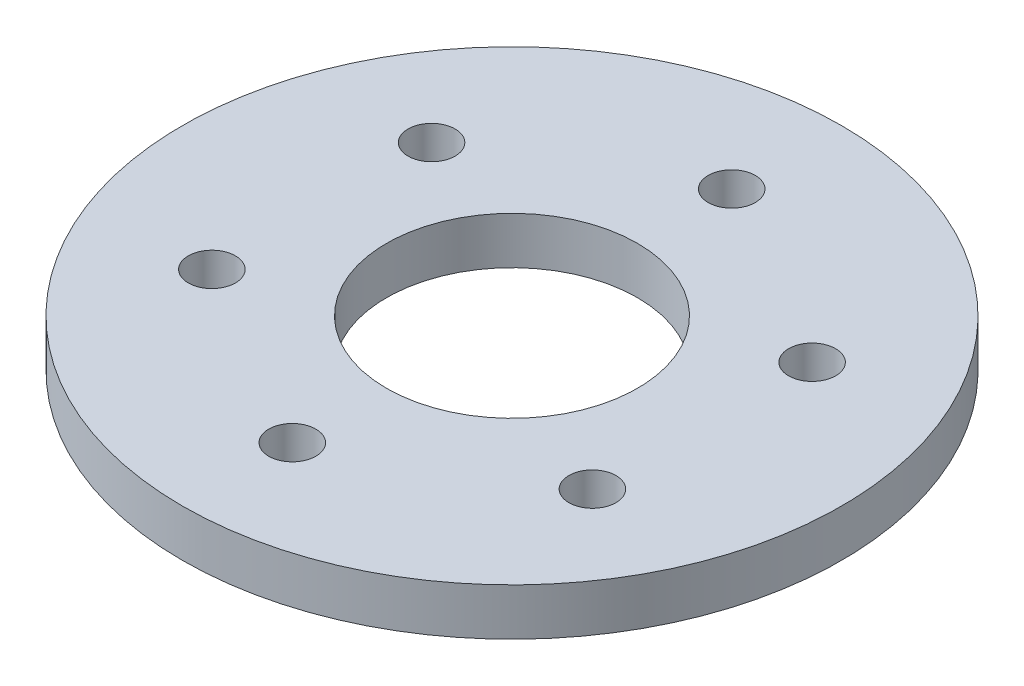
ISO-10303-21;
HEADER;
FILE_DESCRIPTION(('STEP AP214'),'2;1');
FILE_NAME('part.step','',(''),(''),'','','');
FILE_SCHEMA(('AUTOMOTIVE_DESIGN { 1 0 10303 214 1 1 1 1 }'));
ENDSEC;
DATA;
#1=APPLICATION_CONTEXT('core data for automotive mechanical design processes');
#2=APPLICATION_PROTOCOL_DEFINITION('international standard','automotive_design',2000,#1);
#3=PRODUCT_CONTEXT('',#1,'mechanical');
#4=PRODUCT('Part','Part','',(#3));
#5=PRODUCT_RELATED_PRODUCT_CATEGORY('part','',(#4));
#6=PRODUCT_DEFINITION_FORMATION('','',#4);
#7=PRODUCT_DEFINITION_CONTEXT('part definition',#1,'design');
#8=PRODUCT_DEFINITION('design','',#6,#7);
#9=PRODUCT_DEFINITION_SHAPE('','',#8);
#10=(LENGTH_UNIT() NAMED_UNIT(*) SI_UNIT(.MILLI.,.METRE.));
#11=(NAMED_UNIT(*) PLANE_ANGLE_UNIT() SI_UNIT($,.RADIAN.));
#12=(NAMED_UNIT(*) SI_UNIT($,.STERADIAN.) SOLID_ANGLE_UNIT());
#13=UNCERTAINTY_MEASURE_WITH_UNIT(LENGTH_MEASURE(1.E-05),#10,'distance_accuracy_value','');
#14=(GEOMETRIC_REPRESENTATION_CONTEXT(3) GLOBAL_UNCERTAINTY_ASSIGNED_CONTEXT((#13)) GLOBAL_UNIT_ASSIGNED_CONTEXT((#10,
#11,#12)) REPRESENTATION_CONTEXT('',''));
#15=CARTESIAN_POINT('',(0.,0.,0.));
#16=DIRECTION('',(0.,0.,1.));
#17=DIRECTION('',(1.,0.,0.));
#18=AXIS2_PLACEMENT_3D('',#15,#16,#17);
#19=CARTESIAN_POINT('',(0.,3.,0.));
#20=DIRECTION('',(0.,1.,0.));
#21=DIRECTION('',(0.,0.,1.));
#22=AXIS2_PLACEMENT_3D('',#19,#20,#21);
#23=PLANE('',#22);
#24=CARTESIAN_POINT('',(-12.1243556529812,3.,7.00000000000052));
#25=DIRECTION('',(0.,1.,0.));
#26=DIRECTION('',(0.,0.,1.));
#27=AXIS2_PLACEMENT_3D('',#24,#25,#26);
#28=CIRCLE('',#27,1.50000000000113);
#29=CARTESIAN_POINT('',(-12.1243556529812,3.,8.50000000000166));
#30=VERTEX_POINT('',#29);
#31=EDGE_CURVE('E74',#30,#30,#28,.T.);
#32=ORIENTED_EDGE('',*,*,#31,.F.);
#33=EDGE_LOOP('',(#32));
#34=FACE_BOUND('',#33,.T.);
#35=CARTESIAN_POINT('',(12.124355652983,3.,6.99999999999948));
#36=DIRECTION('',(0.,1.,0.));
#37=DIRECTION('',(0.,0.,1.));
#38=AXIS2_PLACEMENT_3D('',#35,#36,#37);
#39=CIRCLE('',#38,1.50000000000077);
#40=CARTESIAN_POINT('',(12.124355652983,3.,8.50000000000025));
#41=VERTEX_POINT('',#40);
#42=EDGE_CURVE('E62',#41,#41,#39,.T.);
#43=ORIENTED_EDGE('',*,*,#42,.F.);
#44=EDGE_LOOP('',(#43));
#45=FACE_BOUND('',#44,.T.);
#46=CARTESIAN_POINT('',(0.,3.,0.));
#47=DIRECTION('',(0.,1.,0.));
#48=DIRECTION('',(0.,0.,1.));
#49=AXIS2_PLACEMENT_3D('',#46,#47,#48);
#50=CIRCLE('',#49,8.);
#51=CARTESIAN_POINT('',(0.,3.,8.));
#52=VERTEX_POINT('',#51);
#53=EDGE_CURVE('E50',#52,#52,#50,.T.);
#54=ORIENTED_EDGE('',*,*,#53,.F.);
#55=EDGE_LOOP('',(#54));
#56=FACE_BOUND('',#55,.T.);
#57=CARTESIAN_POINT('',(0.,3.,0.));
#58=DIRECTION('',(0.,1.,0.));
#59=DIRECTION('',(0.,0.,1.));
#60=AXIS2_PLACEMENT_3D('',#57,#58,#59);
#61=CIRCLE('',#60,21.);
#62=CARTESIAN_POINT('',(0.,3.,21.));
#63=VERTEX_POINT('',#62);
#64=EDGE_CURVE('E10',#63,#63,#61,.T.);
#65=ORIENTED_EDGE('',*,*,#64,.T.);
#66=EDGE_LOOP('',(#65));
#67=FACE_BOUND('',#66,.T.);
#68=CARTESIAN_POINT('',(0.,3.,-14.));
#69=DIRECTION('',(0.,1.,0.));
#70=DIRECTION('',(0.,0.,1.));
#71=AXIS2_PLACEMENT_3D('',#68,#69,#70);
#72=CIRCLE('',#71,1.5);
#73=CARTESIAN_POINT('',(0.,3.,-12.5));
#74=VERTEX_POINT('',#73);
#75=EDGE_CURVE('E45',#74,#74,#72,.T.);
#76=ORIENTED_EDGE('',*,*,#75,.F.);
#77=EDGE_LOOP('',(#76));
#78=FACE_BOUND('',#77,.T.);
#79=CARTESIAN_POINT('',(12.1243556529824,3.,-7.00000000000052));
#80=DIRECTION('',(0.,1.,0.));
#81=DIRECTION('',(0.,0.,1.));
#82=AXIS2_PLACEMENT_3D('',#79,#80,#81);
#83=CIRCLE('',#82,1.50000000000017);
#84=CARTESIAN_POINT('',(12.1243556529824,3.,-5.50000000000035));
#85=VERTEX_POINT('',#84);
#86=EDGE_CURVE('E56',#85,#85,#83,.T.);
#87=ORIENTED_EDGE('',*,*,#86,.F.);
#88=EDGE_LOOP('',(#87));
#89=FACE_BOUND('',#88,.T.);
#90=CARTESIAN_POINT('',(1.18856827952055E-12,3.,14.));
#91=DIRECTION('',(0.,1.,0.));
#92=DIRECTION('',(0.,0.,1.));
#93=AXIS2_PLACEMENT_3D('',#90,#91,#92);
#94=CIRCLE('',#93,1.50000000000123);
#95=CARTESIAN_POINT('',(1.18856827952055E-12,3.,15.5000000000012));
#96=VERTEX_POINT('',#95);
#97=EDGE_CURVE('E68',#96,#96,#94,.T.);
#98=ORIENTED_EDGE('',*,*,#97,.F.);
#99=EDGE_LOOP('',(#98));
#100=FACE_BOUND('',#99,.T.);
#101=CARTESIAN_POINT('',(-12.1243556529819,3.,-6.99999999999948));
#102=DIRECTION('',(0.,1.,0.));
#103=DIRECTION('',(0.,0.,1.));
#104=AXIS2_PLACEMENT_3D('',#101,#102,#103);
#105=CIRCLE('',#104,1.5000000000006);
#106=CARTESIAN_POINT('',(-12.1243556529819,3.,-5.49999999999888));
#107=VERTEX_POINT('',#106);
#108=EDGE_CURVE('E80',#107,#107,#105,.T.);
#109=ORIENTED_EDGE('',*,*,#108,.F.);
#110=EDGE_LOOP('',(#109));
#111=FACE_BOUND('',#110,.T.);
#112=ADVANCED_FACE('F34',(#34,#45,#56,#67,#78,#89,#100,#111),#23,.T.);
#113=CARTESIAN_POINT('',(0.,0.,0.));
#114=DIRECTION('',(0.,1.,0.));
#115=DIRECTION('',(0.,0.,1.));
#116=AXIS2_PLACEMENT_3D('',#113,#114,#115);
#117=PLANE('',#116);
#118=CARTESIAN_POINT('',(0.,0.,0.));
#119=DIRECTION('',(0.,1.,0.));
#120=DIRECTION('',(0.,0.,1.));
#121=AXIS2_PLACEMENT_3D('',#118,#119,#120);
#122=CIRCLE('',#121,21.);
#123=CARTESIAN_POINT('',(0.,0.,21.));
#124=VERTEX_POINT('',#123);
#125=EDGE_CURVE('E38',#124,#124,#122,.T.);
#126=ORIENTED_EDGE('',*,*,#125,.F.);
#127=EDGE_LOOP('',(#126));
#128=FACE_BOUND('',#127,.T.);
#129=CARTESIAN_POINT('',(0.,0.,-14.));
#130=DIRECTION('',(0.,1.,0.));
#131=DIRECTION('',(0.,0.,1.));
#132=AXIS2_PLACEMENT_3D('',#129,#130,#131);
#133=CIRCLE('',#132,1.5);
#134=CARTESIAN_POINT('',(0.,0.,-12.5));
#135=VERTEX_POINT('',#134);
#136=EDGE_CURVE('E47',#135,#135,#133,.T.);
#137=ORIENTED_EDGE('',*,*,#136,.T.);
#138=EDGE_LOOP('',(#137));
#139=FACE_BOUND('',#138,.T.);
#140=CARTESIAN_POINT('',(0.,0.,0.));
#141=DIRECTION('',(0.,1.,0.));
#142=DIRECTION('',(0.,0.,1.));
#143=AXIS2_PLACEMENT_3D('',#140,#141,#142);
#144=CIRCLE('',#143,8.);
#145=CARTESIAN_POINT('',(0.,0.,8.));
#146=VERTEX_POINT('',#145);
#147=EDGE_CURVE('E53',#146,#146,#144,.T.);
#148=ORIENTED_EDGE('',*,*,#147,.T.);
#149=EDGE_LOOP('',(#148));
#150=FACE_BOUND('',#149,.T.);
#151=CARTESIAN_POINT('',(12.1243556529824,0.,-7.00000000000052));
#152=DIRECTION('',(0.,1.,0.));
#153=DIRECTION('',(0.,0.,1.));
#154=AXIS2_PLACEMENT_3D('',#151,#152,#153);
#155=CIRCLE('',#154,1.50000000000017);
#156=CARTESIAN_POINT('',(12.1243556529824,0.,-5.50000000000035));
#157=VERTEX_POINT('',#156);
#158=EDGE_CURVE('E59',#157,#157,#155,.T.);
#159=ORIENTED_EDGE('',*,*,#158,.T.);
#160=EDGE_LOOP('',(#159));
#161=FACE_BOUND('',#160,.T.);
#162=CARTESIAN_POINT('',(12.124355652983,0.,6.99999999999948));
#163=DIRECTION('',(0.,1.,0.));
#164=DIRECTION('',(0.,0.,1.));
#165=AXIS2_PLACEMENT_3D('',#162,#163,#164);
#166=CIRCLE('',#165,1.50000000000077);
#167=CARTESIAN_POINT('',(12.124355652983,0.,8.50000000000025));
#168=VERTEX_POINT('',#167);
#169=EDGE_CURVE('E65',#168,#168,#166,.T.);
#170=ORIENTED_EDGE('',*,*,#169,.T.);
#171=EDGE_LOOP('',(#170));
#172=FACE_BOUND('',#171,.T.);
#173=CARTESIAN_POINT('',(1.18856827952055E-12,0.,14.));
#174=DIRECTION('',(0.,1.,0.));
#175=DIRECTION('',(0.,0.,1.));
#176=AXIS2_PLACEMENT_3D('',#173,#174,#175);
#177=CIRCLE('',#176,1.50000000000123);
#178=CARTESIAN_POINT('',(1.18856827952055E-12,0.,15.5000000000012));
#179=VERTEX_POINT('',#178);
#180=EDGE_CURVE('E71',#179,#179,#177,.T.);
#181=ORIENTED_EDGE('',*,*,#180,.T.);
#182=EDGE_LOOP('',(#181));
#183=FACE_BOUND('',#182,.T.);
#184=CARTESIAN_POINT('',(-12.1243556529812,0.,7.00000000000052));
#185=DIRECTION('',(0.,1.,0.));
#186=DIRECTION('',(0.,0.,1.));
#187=AXIS2_PLACEMENT_3D('',#184,#185,#186);
#188=CIRCLE('',#187,1.50000000000113);
#189=CARTESIAN_POINT('',(-12.1243556529812,0.,8.50000000000166));
#190=VERTEX_POINT('',#189);
#191=EDGE_CURVE('E77',#190,#190,#188,.T.);
#192=ORIENTED_EDGE('',*,*,#191,.T.);
#193=EDGE_LOOP('',(#192));
#194=FACE_BOUND('',#193,.T.);
#195=CARTESIAN_POINT('',(-12.1243556529819,0.,-6.99999999999948));
#196=DIRECTION('',(0.,1.,0.));
#197=DIRECTION('',(0.,0.,1.));
#198=AXIS2_PLACEMENT_3D('',#195,#196,#197);
#199=CIRCLE('',#198,1.5000000000006);
#200=CARTESIAN_POINT('',(-12.1243556529819,0.,-5.49999999999888));
#201=VERTEX_POINT('',#200);
#202=EDGE_CURVE('E83',#201,#201,#199,.T.);
#203=ORIENTED_EDGE('',*,*,#202,.T.);
#204=EDGE_LOOP('',(#203));
#205=FACE_BOUND('',#204,.T.);
#206=ADVANCED_FACE('F93',(#128,#139,#150,#161,#172,#183,#194,#205),#117,.F.);
#207=CARTESIAN_POINT('',(0.,3.,0.));
#208=DIRECTION('',(0.,-1.,0.));
#209=DIRECTION('',(0.,0.,-1.));
#210=AXIS2_PLACEMENT_3D('',#207,#208,#209);
#211=CYLINDRICAL_SURFACE('',#210,21.);
#212=ORIENTED_EDGE('',*,*,#64,.F.);
#213=EDGE_LOOP('',(#212));
#214=FACE_BOUND('',#213,.T.);
#215=ORIENTED_EDGE('',*,*,#125,.T.);
#216=EDGE_LOOP('',(#215));
#217=FACE_BOUND('',#216,.T.);
#218=ADVANCED_FACE('F36',(#214,#217),#211,.T.);
#219=CARTESIAN_POINT('',(0.,3.,-14.));
#220=DIRECTION('',(0.,-1.,0.));
#221=DIRECTION('',(0.,0.,-1.));
#222=AXIS2_PLACEMENT_3D('',#219,#220,#221);
#223=CYLINDRICAL_SURFACE('',#222,1.5);
#224=ORIENTED_EDGE('',*,*,#75,.T.);
#225=EDGE_LOOP('',(#224));
#226=FACE_BOUND('',#225,.T.);
#227=ORIENTED_EDGE('',*,*,#136,.F.);
#228=EDGE_LOOP('',(#227));
#229=FACE_BOUND('',#228,.T.);
#230=ADVANCED_FACE('F103',(#226,#229),#223,.F.);
#231=CARTESIAN_POINT('',(0.,3.,0.));
#232=DIRECTION('',(0.,-1.,0.));
#233=DIRECTION('',(0.,0.,-1.));
#234=AXIS2_PLACEMENT_3D('',#231,#232,#233);
#235=CYLINDRICAL_SURFACE('',#234,8.);
#236=ORIENTED_EDGE('',*,*,#53,.T.);
#237=EDGE_LOOP('',(#236));
#238=FACE_BOUND('',#237,.T.);
#239=ORIENTED_EDGE('',*,*,#147,.F.);
#240=EDGE_LOOP('',(#239));
#241=FACE_BOUND('',#240,.T.);
#242=ADVANCED_FACE('F106',(#238,#241),#235,.F.);
#243=CARTESIAN_POINT('',(12.1243556529824,3.,-7.00000000000052));
#244=DIRECTION('',(0.,-1.,0.));
#245=DIRECTION('',(0.,0.,-1.));
#246=AXIS2_PLACEMENT_3D('',#243,#244,#245);
#247=CYLINDRICAL_SURFACE('',#246,1.50000000000017);
#248=ORIENTED_EDGE('',*,*,#86,.T.);
#249=EDGE_LOOP('',(#248));
#250=FACE_BOUND('',#249,.T.);
#251=ORIENTED_EDGE('',*,*,#158,.F.);
#252=EDGE_LOOP('',(#251));
#253=FACE_BOUND('',#252,.T.);
#254=ADVANCED_FACE('F110',(#250,#253),#247,.F.);
#255=CARTESIAN_POINT('',(12.124355652983,3.,6.99999999999948));
#256=DIRECTION('',(0.,-1.,0.));
#257=DIRECTION('',(0.,0.,-1.));
#258=AXIS2_PLACEMENT_3D('',#255,#256,#257);
#259=CYLINDRICAL_SURFACE('',#258,1.50000000000077);
#260=ORIENTED_EDGE('',*,*,#42,.T.);
#261=EDGE_LOOP('',(#260));
#262=FACE_BOUND('',#261,.T.);
#263=ORIENTED_EDGE('',*,*,#169,.F.);
#264=EDGE_LOOP('',(#263));
#265=FACE_BOUND('',#264,.T.);
#266=ADVANCED_FACE('F114',(#262,#265),#259,.F.);
#267=CARTESIAN_POINT('',(1.18856827952055E-12,3.,14.));
#268=DIRECTION('',(0.,-1.,0.));
#269=DIRECTION('',(0.,0.,-1.));
#270=AXIS2_PLACEMENT_3D('',#267,#268,#269);
#271=CYLINDRICAL_SURFACE('',#270,1.50000000000123);
#272=ORIENTED_EDGE('',*,*,#97,.T.);
#273=EDGE_LOOP('',(#272));
#274=FACE_BOUND('',#273,.T.);
#275=ORIENTED_EDGE('',*,*,#180,.F.);
#276=EDGE_LOOP('',(#275));
#277=FACE_BOUND('',#276,.T.);
#278=ADVANCED_FACE('F118',(#274,#277),#271,.F.);
#279=CARTESIAN_POINT('',(-12.1243556529812,3.,7.00000000000052));
#280=DIRECTION('',(0.,-1.,0.));
#281=DIRECTION('',(0.,0.,-1.));
#282=AXIS2_PLACEMENT_3D('',#279,#280,#281);
#283=CYLINDRICAL_SURFACE('',#282,1.50000000000113);
#284=ORIENTED_EDGE('',*,*,#31,.T.);
#285=EDGE_LOOP('',(#284));
#286=FACE_BOUND('',#285,.T.);
#287=ORIENTED_EDGE('',*,*,#191,.F.);
#288=EDGE_LOOP('',(#287));
#289=FACE_BOUND('',#288,.T.);
#290=ADVANCED_FACE('F122',(#286,#289),#283,.F.);
#291=CARTESIAN_POINT('',(-12.1243556529819,3.,-6.99999999999948));
#292=DIRECTION('',(0.,-1.,0.));
#293=DIRECTION('',(0.,0.,-1.));
#294=AXIS2_PLACEMENT_3D('',#291,#292,#293);
#295=CYLINDRICAL_SURFACE('',#294,1.5000000000006);
#296=ORIENTED_EDGE('',*,*,#108,.T.);
#297=EDGE_LOOP('',(#296));
#298=FACE_BOUND('',#297,.T.);
#299=ORIENTED_EDGE('',*,*,#202,.F.);
#300=EDGE_LOOP('',(#299));
#301=FACE_BOUND('',#300,.T.);
#302=ADVANCED_FACE('F89',(#298,#301),#295,.F.);
#303=CLOSED_SHELL('',(#112,#206,#218,#230,#242,#254,#266,#278,#290,#302));
#304=MANIFOLD_SOLID_BREP('B2',#303);
#305=ADVANCED_BREP_SHAPE_REPRESENTATION('',(#18,#304),#14);
#306=SHAPE_DEFINITION_REPRESENTATION(#9,#305);
ENDSEC;
END-ISO-10303-21;
